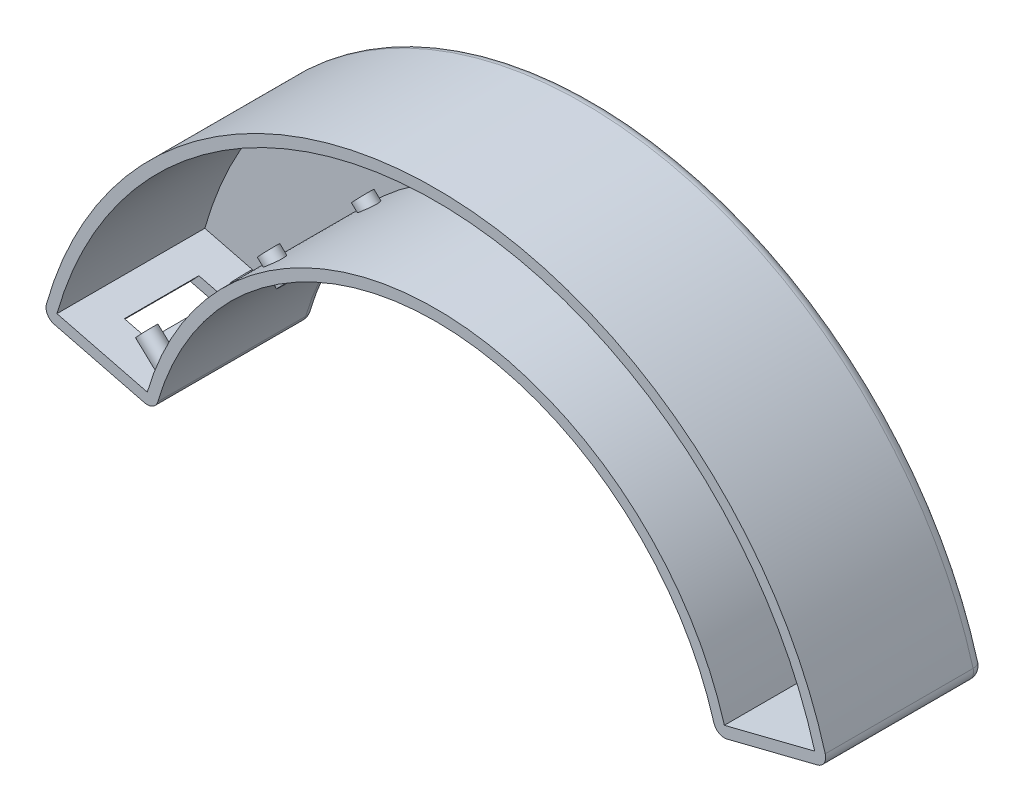
ISO-10303-21;
HEADER;
FILE_DESCRIPTION(('STEP AP214'),'2;1');
FILE_NAME('part.step','',(''),(''),'','','');
FILE_SCHEMA(('AUTOMOTIVE_DESIGN { 1 0 10303 214 1 1 1 1 }'));
ENDSEC;
DATA;
#1=APPLICATION_CONTEXT('core data for automotive mechanical design processes');
#2=APPLICATION_PROTOCOL_DEFINITION('international standard','automotive_design',2000,#1);
#3=PRODUCT_CONTEXT('',#1,'mechanical');
#4=PRODUCT('Part','Part','',(#3));
#5=PRODUCT_RELATED_PRODUCT_CATEGORY('part','',(#4));
#6=PRODUCT_DEFINITION_FORMATION('','',#4);
#7=PRODUCT_DEFINITION_CONTEXT('part definition',#1,'design');
#8=PRODUCT_DEFINITION('design','',#6,#7);
#9=PRODUCT_DEFINITION_SHAPE('','',#8);
#10=(LENGTH_UNIT() NAMED_UNIT(*) SI_UNIT(.MILLI.,.METRE.));
#11=(NAMED_UNIT(*) PLANE_ANGLE_UNIT() SI_UNIT($,.RADIAN.));
#12=(NAMED_UNIT(*) SI_UNIT($,.STERADIAN.) SOLID_ANGLE_UNIT());
#13=UNCERTAINTY_MEASURE_WITH_UNIT(LENGTH_MEASURE(1.E-05),#10,'distance_accuracy_value','');
#14=(GEOMETRIC_REPRESENTATION_CONTEXT(3) GLOBAL_UNCERTAINTY_ASSIGNED_CONTEXT((#13)) GLOBAL_UNIT_ASSIGNED_CONTEXT((#10,
#11,#12)) REPRESENTATION_CONTEXT('',''));
#15=CARTESIAN_POINT('',(0.,0.,0.));
#16=DIRECTION('',(0.,0.,1.));
#17=DIRECTION('',(1.,0.,0.));
#18=AXIS2_PLACEMENT_3D('',#15,#16,#17);
#19=CARTESIAN_POINT('',(20.0214909822142,39.2804021780634,8.6875132663522));
#20=DIRECTION('',(-0.731353701619169,0.6819983600625,0.));
#21=DIRECTION('',(-0.6819983600625,-0.731353701619169,0.));
#22=AXIS2_PLACEMENT_3D('',#19,#20,#21);
#23=PLANE('',#22);
#24=CARTESIAN_POINT('',(20.0214909822142,39.2804021780634,8.6875132663522));
#25=DIRECTION('',(-0.731353701619169,0.6819983600625,0.));
#26=DIRECTION('',(-0.6819983600625,-0.731353701619169,0.));
#27=AXIS2_PLACEMENT_3D('',#24,#25,#26);
#28=CIRCLE('',#27,2.159);
#29=CARTESIAN_POINT('',(18.5490565228393,37.7014095362676,8.6875132663522));
#30=VERTEX_POINT('',#29);
#31=EDGE_CURVE('E11',#30,#30,#28,.T.);
#32=ORIENTED_EDGE('',*,*,#31,.T.);
#33=EDGE_LOOP('',(#32));
#34=FACE_BOUND('',#33,.T.);
#35=CARTESIAN_POINT('',(20.0214909822142,39.2804021780634,8.6875132663522));
#36=DIRECTION('',(-0.731353701619169,0.6819983600625,0.));
#37=DIRECTION('',(-0.6819983600625,-0.731353701619169,0.));
#38=AXIS2_PLACEMENT_3D('',#35,#36,#37);
#39=CIRCLE('',#38,1.39700000000001);
#40=CARTESIAN_POINT('',(19.0687392732069,38.2587010569014,8.6875132663522));
#41=VERTEX_POINT('',#40);
#42=EDGE_CURVE('E55',#41,#41,#39,.T.);
#43=ORIENTED_EDGE('',*,*,#42,.F.);
#44=EDGE_LOOP('',(#43));
#45=FACE_BOUND('',#44,.T.);
#46=ADVANCED_FACE('F48',(#34,#45),#23,.T.);
#47=CARTESIAN_POINT('',(20.0214909822142,39.2804021780634,8.6875132663522));
#48=DIRECTION('',(0.731353701619169,-0.6819983600625,0.));
#49=DIRECTION('',(0.6819983600625,0.731353701619169,0.));
#50=AXIS2_PLACEMENT_3D('',#47,#48,#49);
#51=CYLINDRICAL_SURFACE('',#50,2.159);
#52=ORIENTED_EDGE('',*,*,#31,.F.);
#53=EDGE_LOOP('',(#52));
#54=FACE_BOUND('',#53,.T.);
#55=CARTESIAN_POINT('',(24.4798231472847,35.1229401751224,8.6875132663522));
#56=DIRECTION('',(-0.731353701619169,0.6819983600625,0.));
#57=DIRECTION('',(-0.6819983600625,-0.731353701619169,0.));
#58=AXIS2_PLACEMENT_3D('',#55,#56,#57);
#59=CIRCLE('',#58,2.159);
#60=CARTESIAN_POINT('',(23.0073886879097,33.5439475333266,8.6875132663522));
#61=VERTEX_POINT('',#60);
#62=EDGE_CURVE('E59',#61,#61,#59,.T.);
#63=ORIENTED_EDGE('',*,*,#62,.T.);
#64=EDGE_LOOP('',(#63));
#65=FACE_BOUND('',#64,.T.);
#66=ADVANCED_FACE('F50',(#54,#65),#51,.T.);
#67=CARTESIAN_POINT('',(20.0214909822142,39.2804021780634,8.6875132663522));
#68=DIRECTION('',(0.731353701619169,-0.6819983600625,0.));
#69=DIRECTION('',(0.6819983600625,0.731353701619169,0.));
#70=AXIS2_PLACEMENT_3D('',#67,#68,#69);
#71=CYLINDRICAL_SURFACE('',#70,1.39700000000001);
#72=ORIENTED_EDGE('',*,*,#42,.T.);
#73=EDGE_LOOP('',(#72));
#74=FACE_BOUND('',#73,.T.);
#75=CARTESIAN_POINT('',(24.4798231472847,35.1229401751224,8.6875132663522));
#76=DIRECTION('',(-0.731353701619169,0.6819983600625,0.));
#77=DIRECTION('',(-0.6819983600625,-0.731353701619169,0.));
#78=AXIS2_PLACEMENT_3D('',#75,#76,#77);
#79=CIRCLE('',#78,1.39700000000001);
#80=CARTESIAN_POINT('',(23.5270714382773,34.1012390539604,8.6875132663522));
#81=VERTEX_POINT('',#80);
#82=EDGE_CURVE('E63',#81,#81,#79,.T.);
#83=ORIENTED_EDGE('',*,*,#82,.F.);
#84=EDGE_LOOP('',(#83));
#85=FACE_BOUND('',#84,.T.);
#86=ADVANCED_FACE('F72',(#74,#85),#71,.F.);
#87=CARTESIAN_POINT('',(24.4798231472847,35.1229401751224,8.6875132663522));
#88=DIRECTION('',(-0.731353701619169,0.6819983600625,0.));
#89=DIRECTION('',(-0.6819983600625,-0.731353701619169,0.));
#90=AXIS2_PLACEMENT_3D('',#87,#88,#89);
#91=PLANE('',#90);
#92=ORIENTED_EDGE('',*,*,#82,.T.);
#93=EDGE_LOOP('',(#92));
#94=FACE_BOUND('',#93,.T.);
#95=ORIENTED_EDGE('',*,*,#62,.F.);
#96=EDGE_LOOP('',(#95));
#97=FACE_BOUND('',#96,.T.);
#98=ADVANCED_FACE('F69',(#94,#97),#91,.F.);
#99=CLOSED_SHELL('',(#46,#66,#86,#98));
#100=MANIFOLD_SOLID_BREP('B2',#99);
#101=CARTESIAN_POINT('',(20.0214909822142,39.2804021780634,30.5315132663522));
#102=DIRECTION('',(-0.731353701619169,0.6819983600625,0.));
#103=DIRECTION('',(-0.6819983600625,-0.731353701619169,0.));
#104=AXIS2_PLACEMENT_3D('',#101,#102,#103);
#105=PLANE('',#104);
#106=CARTESIAN_POINT('',(20.0214909822142,39.2804021780634,30.5315132663522));
#107=DIRECTION('',(-0.731353701619169,0.6819983600625,0.));
#108=DIRECTION('',(-0.6819983600625,-0.731353701619169,0.));
#109=AXIS2_PLACEMENT_3D('',#106,#107,#108);
#110=CIRCLE('',#109,2.159);
#111=CARTESIAN_POINT('',(18.5490565228393,37.7014095362676,30.5315132663522));
#112=VERTEX_POINT('',#111);
#113=EDGE_CURVE('E47',#112,#112,#110,.T.);
#114=ORIENTED_EDGE('',*,*,#113,.T.);
#115=EDGE_LOOP('',(#114));
#116=FACE_BOUND('',#115,.T.);
#117=CARTESIAN_POINT('',(20.0214909822142,39.2804021780634,30.5315132663522));
#118=DIRECTION('',(-0.731353701619169,0.6819983600625,0.));
#119=DIRECTION('',(-0.6819983600625,-0.731353701619169,0.));
#120=AXIS2_PLACEMENT_3D('',#117,#118,#119);
#121=CIRCLE('',#120,1.397);
#122=CARTESIAN_POINT('',(19.0687392732069,38.2587010569014,30.5315132663522));
#123=VERTEX_POINT('',#122);
#124=EDGE_CURVE('E125',#123,#123,#121,.T.);
#125=ORIENTED_EDGE('',*,*,#124,.F.);
#126=EDGE_LOOP('',(#125));
#127=FACE_BOUND('',#126,.T.);
#128=ADVANCED_FACE('F118',(#116,#127),#105,.T.);
#129=CARTESIAN_POINT('',(20.0214909822142,39.2804021780634,30.5315132663522));
#130=DIRECTION('',(0.731353701619169,-0.6819983600625,0.));
#131=DIRECTION('',(0.6819983600625,0.731353701619169,0.));
#132=AXIS2_PLACEMENT_3D('',#129,#130,#131);
#133=CYLINDRICAL_SURFACE('',#132,2.159);
#134=ORIENTED_EDGE('',*,*,#113,.F.);
#135=EDGE_LOOP('',(#134));
#136=FACE_BOUND('',#135,.T.);
#137=CARTESIAN_POINT('',(24.4798231472847,35.1229401751224,30.5315132663522));
#138=DIRECTION('',(-0.731353701619169,0.6819983600625,0.));
#139=DIRECTION('',(-0.6819983600625,-0.731353701619169,0.));
#140=AXIS2_PLACEMENT_3D('',#137,#138,#139);
#141=CIRCLE('',#140,2.159);
#142=CARTESIAN_POINT('',(23.0073886879097,33.5439475333266,30.5315132663522));
#143=VERTEX_POINT('',#142);
#144=EDGE_CURVE('E129',#143,#143,#141,.T.);
#145=ORIENTED_EDGE('',*,*,#144,.T.);
#146=EDGE_LOOP('',(#145));
#147=FACE_BOUND('',#146,.T.);
#148=ADVANCED_FACE('F120',(#136,#147),#133,.T.);
#149=CARTESIAN_POINT('',(20.0214909822142,39.2804021780634,30.5315132663522));
#150=DIRECTION('',(0.731353701619169,-0.6819983600625,0.));
#151=DIRECTION('',(0.6819983600625,0.731353701619169,0.));
#152=AXIS2_PLACEMENT_3D('',#149,#150,#151);
#153=CYLINDRICAL_SURFACE('',#152,1.397);
#154=ORIENTED_EDGE('',*,*,#124,.T.);
#155=EDGE_LOOP('',(#154));
#156=FACE_BOUND('',#155,.T.);
#157=CARTESIAN_POINT('',(24.4798231472847,35.1229401751224,30.5315132663522));
#158=DIRECTION('',(-0.731353701619169,0.6819983600625,0.));
#159=DIRECTION('',(-0.6819983600625,-0.731353701619169,0.));
#160=AXIS2_PLACEMENT_3D('',#157,#158,#159);
#161=CIRCLE('',#160,1.397);
#162=CARTESIAN_POINT('',(23.5270714382774,34.1012390539604,30.5315132663522));
#163=VERTEX_POINT('',#162);
#164=EDGE_CURVE('E133',#163,#163,#161,.T.);
#165=ORIENTED_EDGE('',*,*,#164,.F.);
#166=EDGE_LOOP('',(#165));
#167=FACE_BOUND('',#166,.T.);
#168=ADVANCED_FACE('F142',(#156,#167),#153,.F.);
#169=CARTESIAN_POINT('',(24.4798231472847,35.1229401751224,30.5315132663522));
#170=DIRECTION('',(-0.731353701619169,0.6819983600625,0.));
#171=DIRECTION('',(-0.6819983600625,-0.731353701619169,0.));
#172=AXIS2_PLACEMENT_3D('',#169,#170,#171);
#173=PLANE('',#172);
#174=ORIENTED_EDGE('',*,*,#164,.T.);
#175=EDGE_LOOP('',(#174));
#176=FACE_BOUND('',#175,.T.);
#177=ORIENTED_EDGE('',*,*,#144,.F.);
#178=EDGE_LOOP('',(#177));
#179=FACE_BOUND('',#178,.T.);
#180=ADVANCED_FACE('F139',(#176,#179),#173,.F.);
#181=CLOSED_SHELL('',(#128,#148,#168,#180));
#182=MANIFOLD_SOLID_BREP('B6',#181);
#183=CARTESIAN_POINT('',(-8.21460512109341,9.00089622362652,8.6875132663522));
#184=DIRECTION('',(-0.731353701619169,0.6819983600625,0.));
#185=DIRECTION('',(-0.6819983600625,-0.731353701619169,0.));
#186=AXIS2_PLACEMENT_3D('',#183,#184,#185);
#187=PLANE('',#186);
#188=CARTESIAN_POINT('',(-8.21460512109341,9.00089622362652,8.6875132663522));
#189=DIRECTION('',(-0.731353701619169,0.6819983600625,0.));
#190=DIRECTION('',(-0.6819983600625,-0.731353701619169,0.));
#191=AXIS2_PLACEMENT_3D('',#188,#189,#190);
#192=CIRCLE('',#191,2.159);
#193=CARTESIAN_POINT('',(-9.68703958046834,7.42190358183074,8.6875132663522));
#194=VERTEX_POINT('',#193);
#195=EDGE_CURVE('E117',#194,#194,#192,.T.);
#196=ORIENTED_EDGE('',*,*,#195,.T.);
#197=EDGE_LOOP('',(#196));
#198=FACE_BOUND('',#197,.T.);
#199=CARTESIAN_POINT('',(-8.21460512109341,9.00089622362652,8.6875132663522));
#200=DIRECTION('',(-0.731353701619169,0.6819983600625,0.));
#201=DIRECTION('',(-0.6819983600625,-0.731353701619169,0.));
#202=AXIS2_PLACEMENT_3D('',#199,#200,#201);
#203=CIRCLE('',#202,1.39699999999999);
#204=CARTESIAN_POINT('',(-9.16735683010071,7.97919510246455,8.6875132663522));
#205=VERTEX_POINT('',#204);
#206=EDGE_CURVE('E195',#205,#205,#203,.T.);
#207=ORIENTED_EDGE('',*,*,#206,.F.);
#208=EDGE_LOOP('',(#207));
#209=FACE_BOUND('',#208,.T.);
#210=ADVANCED_FACE('F188',(#198,#209),#187,.T.);
#211=CARTESIAN_POINT('',(-8.21460512109341,9.00089622362652,8.6875132663522));
#212=DIRECTION('',(0.731353701619169,-0.6819983600625,0.));
#213=DIRECTION('',(0.6819983600625,0.731353701619169,0.));
#214=AXIS2_PLACEMENT_3D('',#211,#212,#213);
#215=CYLINDRICAL_SURFACE('',#214,2.159);
#216=ORIENTED_EDGE('',*,*,#195,.F.);
#217=EDGE_LOOP('',(#216));
#218=FACE_BOUND('',#217,.T.);
#219=CARTESIAN_POINT('',(-3.75627295602295,4.84343422068553,8.6875132663522));
#220=DIRECTION('',(-0.731353701619169,0.6819983600625,0.));
#221=DIRECTION('',(-0.6819983600625,-0.731353701619169,0.));
#222=AXIS2_PLACEMENT_3D('',#219,#220,#221);
#223=CIRCLE('',#222,2.159);
#224=CARTESIAN_POINT('',(-5.22870741539788,3.26444157888974,8.6875132663522));
#225=VERTEX_POINT('',#224);
#226=EDGE_CURVE('E199',#225,#225,#223,.T.);
#227=ORIENTED_EDGE('',*,*,#226,.T.);
#228=EDGE_LOOP('',(#227));
#229=FACE_BOUND('',#228,.T.);
#230=ADVANCED_FACE('F190',(#218,#229),#215,.T.);
#231=CARTESIAN_POINT('',(-8.21460512109341,9.00089622362652,8.6875132663522));
#232=DIRECTION('',(0.731353701619169,-0.6819983600625,0.));
#233=DIRECTION('',(0.6819983600625,0.731353701619169,0.));
#234=AXIS2_PLACEMENT_3D('',#231,#232,#233);
#235=CYLINDRICAL_SURFACE('',#234,1.39699999999999);
#236=ORIENTED_EDGE('',*,*,#206,.T.);
#237=EDGE_LOOP('',(#236));
#238=FACE_BOUND('',#237,.T.);
#239=CARTESIAN_POINT('',(-3.75627295602295,4.84343422068553,8.6875132663522));
#240=DIRECTION('',(-0.731353701619169,0.6819983600625,0.));
#241=DIRECTION('',(-0.6819983600625,-0.731353701619169,0.));
#242=AXIS2_PLACEMENT_3D('',#239,#240,#241);
#243=CIRCLE('',#242,1.39699999999999);
#244=CARTESIAN_POINT('',(-4.70902466503026,3.82173309952355,8.6875132663522));
#245=VERTEX_POINT('',#244);
#246=EDGE_CURVE('E203',#245,#245,#243,.T.);
#247=ORIENTED_EDGE('',*,*,#246,.F.);
#248=EDGE_LOOP('',(#247));
#249=FACE_BOUND('',#248,.T.);
#250=ADVANCED_FACE('F212',(#238,#249),#235,.F.);
#251=CARTESIAN_POINT('',(-3.75627295602295,4.84343422068553,8.6875132663522));
#252=DIRECTION('',(-0.731353701619169,0.6819983600625,0.));
#253=DIRECTION('',(-0.6819983600625,-0.731353701619169,0.));
#254=AXIS2_PLACEMENT_3D('',#251,#252,#253);
#255=PLANE('',#254);
#256=ORIENTED_EDGE('',*,*,#246,.T.);
#257=EDGE_LOOP('',(#256));
#258=FACE_BOUND('',#257,.T.);
#259=ORIENTED_EDGE('',*,*,#226,.F.);
#260=EDGE_LOOP('',(#259));
#261=FACE_BOUND('',#260,.T.);
#262=ADVANCED_FACE('F209',(#258,#261),#255,.F.);
#263=CLOSED_SHELL('',(#210,#230,#250,#262));
#264=MANIFOLD_SOLID_BREP('B42',#263);
#265=CARTESIAN_POINT('',(-8.21460512109341,9.00089622362652,30.5315132663522));
#266=DIRECTION('',(-0.731353701619169,0.6819983600625,0.));
#267=DIRECTION('',(-0.6819983600625,-0.731353701619169,0.));
#268=AXIS2_PLACEMENT_3D('',#265,#266,#267);
#269=PLANE('',#268);
#270=CARTESIAN_POINT('',(-8.21460512109341,9.00089622362652,30.5315132663522));
#271=DIRECTION('',(-0.731353701619169,0.6819983600625,0.));
#272=DIRECTION('',(-0.6819983600625,-0.731353701619169,0.));
#273=AXIS2_PLACEMENT_3D('',#270,#271,#272);
#274=CIRCLE('',#273,2.159);
#275=CARTESIAN_POINT('',(-9.68703958046834,7.42190358183074,30.5315132663522));
#276=VERTEX_POINT('',#275);
#277=EDGE_CURVE('E187',#276,#276,#274,.T.);
#278=ORIENTED_EDGE('',*,*,#277,.T.);
#279=EDGE_LOOP('',(#278));
#280=FACE_BOUND('',#279,.T.);
#281=CARTESIAN_POINT('',(-8.21460512109341,9.00089622362652,30.5315132663522));
#282=DIRECTION('',(-0.731353701619169,0.6819983600625,0.));
#283=DIRECTION('',(-0.6819983600625,-0.731353701619169,0.));
#284=AXIS2_PLACEMENT_3D('',#281,#282,#283);
#285=CIRCLE('',#284,1.39699999999999);
#286=CARTESIAN_POINT('',(-9.16735683010071,7.97919510246455,30.5315132663522));
#287=VERTEX_POINT('',#286);
#288=EDGE_CURVE('E266',#287,#287,#285,.T.);
#289=ORIENTED_EDGE('',*,*,#288,.F.);
#290=EDGE_LOOP('',(#289));
#291=FACE_BOUND('',#290,.T.);
#292=ADVANCED_FACE('F259',(#280,#291),#269,.T.);
#293=CARTESIAN_POINT('',(-8.21460512109341,9.00089622362652,30.5315132663522));
#294=DIRECTION('',(0.731353701619169,-0.6819983600625,0.));
#295=DIRECTION('',(0.6819983600625,0.731353701619169,0.));
#296=AXIS2_PLACEMENT_3D('',#293,#294,#295);
#297=CYLINDRICAL_SURFACE('',#296,2.159);
#298=ORIENTED_EDGE('',*,*,#277,.F.);
#299=EDGE_LOOP('',(#298));
#300=FACE_BOUND('',#299,.T.);
#301=CARTESIAN_POINT('',(-3.75627295602295,4.84343422068553,30.5315132663522));
#302=DIRECTION('',(-0.731353701619169,0.6819983600625,0.));
#303=DIRECTION('',(-0.6819983600625,-0.731353701619169,0.));
#304=AXIS2_PLACEMENT_3D('',#301,#302,#303);
#305=CIRCLE('',#304,2.159);
#306=CARTESIAN_POINT('',(-5.22870741539789,3.26444157888974,30.5315132663522));
#307=VERTEX_POINT('',#306);
#308=EDGE_CURVE('E270',#307,#307,#305,.T.);
#309=ORIENTED_EDGE('',*,*,#308,.T.);
#310=EDGE_LOOP('',(#309));
#311=FACE_BOUND('',#310,.T.);
#312=ADVANCED_FACE('F261',(#300,#311),#297,.T.);
#313=CARTESIAN_POINT('',(-8.21460512109341,9.00089622362652,30.5315132663522));
#314=DIRECTION('',(0.731353701619169,-0.6819983600625,0.));
#315=DIRECTION('',(0.6819983600625,0.731353701619169,0.));
#316=AXIS2_PLACEMENT_3D('',#313,#314,#315);
#317=CYLINDRICAL_SURFACE('',#316,1.39699999999999);
#318=ORIENTED_EDGE('',*,*,#288,.T.);
#319=EDGE_LOOP('',(#318));
#320=FACE_BOUND('',#319,.T.);
#321=CARTESIAN_POINT('',(-3.75627295602295,4.84343422068553,30.5315132663522));
#322=DIRECTION('',(-0.731353701619169,0.6819983600625,0.));
#323=DIRECTION('',(-0.6819983600625,-0.731353701619169,0.));
#324=AXIS2_PLACEMENT_3D('',#321,#322,#323);
#325=CIRCLE('',#324,1.39699999999999);
#326=CARTESIAN_POINT('',(-4.70902466503026,3.82173309952355,30.5315132663522));
#327=VERTEX_POINT('',#326);
#328=EDGE_CURVE('E274',#327,#327,#325,.T.);
#329=ORIENTED_EDGE('',*,*,#328,.F.);
#330=EDGE_LOOP('',(#329));
#331=FACE_BOUND('',#330,.T.);
#332=ADVANCED_FACE('F283',(#320,#331),#317,.F.);
#333=CARTESIAN_POINT('',(-3.75627295602295,4.84343422068553,30.5315132663522));
#334=DIRECTION('',(-0.731353701619169,0.6819983600625,0.));
#335=DIRECTION('',(-0.6819983600625,-0.731353701619169,0.));
#336=AXIS2_PLACEMENT_3D('',#333,#334,#335);
#337=PLANE('',#336);
#338=ORIENTED_EDGE('',*,*,#328,.T.);
#339=EDGE_LOOP('',(#338));
#340=FACE_BOUND('',#339,.T.);
#341=ORIENTED_EDGE('',*,*,#308,.F.);
#342=EDGE_LOOP('',(#341));
#343=FACE_BOUND('',#342,.T.);
#344=ADVANCED_FACE('F280',(#340,#343),#337,.F.);
#345=CLOSED_SHELL('',(#292,#312,#332,#344));
#346=MANIFOLD_SOLID_BREP('B112',#345);
#347=CARTESIAN_POINT('',(0.620773039929204,2.46297398136827,36.83));
#348=DIRECTION('',(-0.244398834617797,-0.969674795814278,0.));
#349=DIRECTION('',(0.969674795814279,-0.244398834617797,0.));
#350=AXIS2_PLACEMENT_3D('',#347,#348,#349);
#351=PLANE('',#350);
#352=DIRECTION('',(-0.969674795814279,0.244398834617797,0.));
#353=VECTOR('',#352,1.);
#354=CARTESIAN_POINT('',(-1.79730203338088,3.07243060794693,2.54));
#355=LINE('',#354,#353);
#356=CARTESIAN_POINT('',(-1.79730203338088,3.07243060794693,2.54));
#357=VERTEX_POINT('',#356);
#358=CARTESIAN_POINT('',(-22.7432053101075,8.35167925187018,2.54));
#359=VERTEX_POINT('',#358);
#360=EDGE_CURVE('E468',#357,#359,#355,.T.);
#361=ORIENTED_EDGE('',*,*,#360,.T.);
#362=DIRECTION('',(0.,0.,-1.));
#363=VECTOR('',#362,1.);
#364=CARTESIAN_POINT('',(-22.7432053101074,8.35167925187017,36.83));
#365=LINE('',#364,#363);
#366=CARTESIAN_POINT('',(-22.7432053101074,8.35167925187017,36.83));
#367=VERTEX_POINT('',#366);
#368=EDGE_CURVE('E511',#367,#359,#365,.T.);
#369=ORIENTED_EDGE('',*,*,#368,.F.);
#370=DIRECTION('',(-0.969674795814279,0.244398834617797,0.));
#371=VECTOR('',#370,1.);
#372=CARTESIAN_POINT('',(0.620773039929204,2.46297398136827,36.83));
#373=LINE('',#372,#371);
#374=CARTESIAN_POINT('',(-1.79730203338088,3.07243060794693,36.83));
#375=VERTEX_POINT('',#374);
#376=EDGE_CURVE('E491',#375,#367,#373,.T.);
#377=ORIENTED_EDGE('',*,*,#376,.F.);
#378=DIRECTION('',(0.,0.,-1.));
#379=VECTOR('',#378,1.);
#380=CARTESIAN_POINT('',(-1.79730203338088,3.07243060794693,36.83));
#381=LINE('',#380,#379);
#382=EDGE_CURVE('E502',#375,#357,#381,.T.);
#383=ORIENTED_EDGE('',*,*,#382,.T.);
#384=EDGE_LOOP('',(#361,#369,#377,#383));
#385=FACE_BOUND('',#384,.T.);
#386=DIRECTION('',(0.969674795814279,-0.244398834617797,0.));
#387=VECTOR('',#386,1.);
#388=CARTESIAN_POINT('',(0.620773039929204,2.46297398136827,28.2455132663522));
#389=LINE('',#388,#387);
#390=CARTESIAN_POINT('',(-15.6877843075608,6.57341639693815,28.2455132663522));
#391=VERTEX_POINT('',#390);
#392=CARTESIAN_POINT('',(-10.063624173378,5.15589148195476,28.2455132663522));
#393=VERTEX_POINT('',#392);
#394=EDGE_CURVE('E454',#391,#393,#389,.T.);
#395=ORIENTED_EDGE('',*,*,#394,.F.);
#396=DIRECTION('',(0.,0.,1.));
#397=VECTOR('',#396,1.);
#398=CARTESIAN_POINT('',(-15.6877843075608,6.57341639693815,36.83));
#399=LINE('',#398,#397);
#400=CARTESIAN_POINT('',(-15.6877843075608,6.57341639693815,10.9735132663522));
#401=VERTEX_POINT('',#400);
#402=EDGE_CURVE('E443',#401,#391,#399,.T.);
#403=ORIENTED_EDGE('',*,*,#402,.F.);
#404=DIRECTION('',(-0.969674795814279,0.244398834617797,0.));
#405=VECTOR('',#404,1.);
#406=CARTESIAN_POINT('',(0.620773039929204,2.46297398136827,10.9735132663522));
#407=LINE('',#406,#405);
#408=CARTESIAN_POINT('',(-10.063624173378,5.15589148195476,10.9735132663522));
#409=VERTEX_POINT('',#408);
#410=EDGE_CURVE('E448',#409,#401,#407,.T.);
#411=ORIENTED_EDGE('',*,*,#410,.F.);
#412=DIRECTION('',(0.,0.,-1.));
#413=VECTOR('',#412,1.);
#414=CARTESIAN_POINT('',(-10.063624173378,5.15589148195476,36.83));
#415=LINE('',#414,#413);
#416=EDGE_CURVE('E459',#393,#409,#415,.T.);
#417=ORIENTED_EDGE('',*,*,#416,.F.);
#418=EDGE_LOOP('',(#395,#403,#411,#417));
#419=FACE_BOUND('',#418,.T.);
#420=ADVANCED_FACE('F321',(#385,#419),#351,.F.);
#421=CARTESIAN_POINT('',(0.,0.,36.83));
#422=DIRECTION('',(-0.2443988346178,-0.969674795814278,0.));
#423=DIRECTION('',(0.969674795814278,-0.2443988346178,0.));
#424=AXIS2_PLACEMENT_3D('',#421,#422,#423);
#425=PLANE('',#424);
#426=DIRECTION('',(-0.969674795814278,0.2443988346178,0.));
#427=VECTOR('',#426,1.);
#428=CARTESIAN_POINT('',(0.,0.,2.54));
#429=LINE('',#428,#427);
#430=CARTESIAN_POINT('',(-23.3639783500367,5.88870527050194,2.54));
#431=VERTEX_POINT('',#430);
#432=CARTESIAN_POINT('',(-2.41807507331012,0.609456626578631,2.54));
#433=VERTEX_POINT('',#432);
#434=EDGE_CURVE('E526',#431,#433,#429,.F.);
#435=ORIENTED_EDGE('',*,*,#434,.T.);
#436=DIRECTION('',(0.,0.,1.));
#437=VECTOR('',#436,1.);
#438=CARTESIAN_POINT('',(-2.41807507331012,0.609456626578631,36.83));
#439=LINE('',#438,#437);
#440=CARTESIAN_POINT('',(-2.41807507331012,0.609456626578632,36.83));
#441=VERTEX_POINT('',#440);
#442=EDGE_CURVE('E580',#433,#441,#439,.T.);
#443=ORIENTED_EDGE('',*,*,#442,.T.);
#444=DIRECTION('',(-0.969674795814278,0.2443988346178,0.));
#445=VECTOR('',#444,1.);
#446=CARTESIAN_POINT('',(0.,0.,36.83));
#447=LINE('',#446,#445);
#448=CARTESIAN_POINT('',(-23.3639783500367,5.88870527050194,36.83));
#449=VERTEX_POINT('',#448);
#450=EDGE_CURVE('E482',#441,#449,#447,.T.);
#451=ORIENTED_EDGE('',*,*,#450,.T.);
#452=DIRECTION('',(0.,0.,-1.));
#453=VECTOR('',#452,1.);
#454=CARTESIAN_POINT('',(-23.3639783500367,5.88870527050194,36.83));
#455=LINE('',#454,#453);
#456=EDGE_CURVE('E578',#449,#431,#455,.T.);
#457=ORIENTED_EDGE('',*,*,#456,.T.);
#458=EDGE_LOOP('',(#435,#443,#451,#457));
#459=FACE_BOUND('',#458,.T.);
#460=DIRECTION('',(0.,0.,1.));
#461=VECTOR('',#460,1.);
#462=CARTESIAN_POINT('',(-17.6655958402513,4.45247319495489,36.83));
#463=LINE('',#462,#461);
#464=CARTESIAN_POINT('',(-17.6655958402513,4.45247319495489,10.9735132663522));
#465=VERTEX_POINT('',#464);
#466=CARTESIAN_POINT('',(-17.6655958402513,4.45247319495489,28.2455132663522));
#467=VERTEX_POINT('',#466);
#468=EDGE_CURVE('E582',#465,#467,#463,.T.);
#469=ORIENTED_EDGE('',*,*,#468,.T.);
#470=DIRECTION('',(0.969674795814278,-0.2443988346178,0.));
#471=VECTOR('',#470,1.);
#472=CARTESIAN_POINT('',(0.,0.,28.2455132663522));
#473=LINE('',#472,#471);
#474=CARTESIAN_POINT('',(-12.0414357060685,3.03494827997149,28.2455132663522));
#475=VERTEX_POINT('',#474);
#476=EDGE_CURVE('E257',#467,#475,#473,.T.);
#477=ORIENTED_EDGE('',*,*,#476,.T.);
#478=DIRECTION('',(0.,0.,-1.));
#479=VECTOR('',#478,1.);
#480=CARTESIAN_POINT('',(-12.0414357060685,3.03494827997149,36.83));
#481=LINE('',#480,#479);
#482=CARTESIAN_POINT('',(-12.0414357060685,3.03494827997149,10.9735132663522));
#483=VERTEX_POINT('',#482);
#484=EDGE_CURVE('E329',#475,#483,#481,.T.);
#485=ORIENTED_EDGE('',*,*,#484,.T.);
#486=DIRECTION('',(-0.969674795814278,0.2443988346178,0.));
#487=VECTOR('',#486,1.);
#488=CARTESIAN_POINT('',(0.,0.,10.9735132663522));
#489=LINE('',#488,#487);
#490=EDGE_CURVE('E589',#483,#465,#489,.T.);
#491=ORIENTED_EDGE('',*,*,#490,.T.);
#492=EDGE_LOOP('',(#469,#477,#485,#491));
#493=FACE_BOUND('',#492,.T.);
#494=ADVANCED_FACE('F593',(#459,#493),#425,.T.);
#495=CARTESIAN_POINT('',(65.1139115965482,-16.411444517581,36.83));
#496=DIRECTION('',(0.,0.,-1.));
#497=DIRECTION('',(-1.,0.,0.));
#498=AXIS2_PLACEMENT_3D('',#495,#496,#497);
#499=CYLINDRICAL_SURFACE('',#498,91.2802568465433);
#500=CARTESIAN_POINT('',(65.1139115965482,-16.411444517581,2.54));
#501=DIRECTION('',(0.,0.,-1.));
#502=DIRECTION('',(-1.,0.,0.));
#503=AXIS2_PLACEMENT_3D('',#500,#501,#502);
#504=CIRCLE('',#503,91.2802568465433);
#505=CARTESIAN_POINT('',(152.971028503204,8.35167925187018,2.54));
#506=VERTEX_POINT('',#505);
#507=EDGE_CURVE('E471',#359,#506,#504,.T.);
#508=ORIENTED_EDGE('',*,*,#507,.T.);
#509=DIRECTION('',(0.,0.,-1.));
#510=VECTOR('',#509,1.);
#511=CARTESIAN_POINT('',(152.971028503204,8.35167925187017,36.83));
#512=LINE('',#511,#510);
#513=CARTESIAN_POINT('',(152.971028503204,8.35167925187017,36.83));
#514=VERTEX_POINT('',#513);
#515=EDGE_CURVE('E508',#514,#506,#512,.T.);
#516=ORIENTED_EDGE('',*,*,#515,.F.);
#517=CARTESIAN_POINT('',(65.1139115965482,-16.411444517581,36.83));
#518=DIRECTION('',(0.,0.,1.));
#519=DIRECTION('',(1.,0.,0.));
#520=AXIS2_PLACEMENT_3D('',#517,#518,#519);
#521=CIRCLE('',#520,91.2802568465433);
#522=EDGE_CURVE('E494',#367,#514,#521,.F.);
#523=ORIENTED_EDGE('',*,*,#522,.F.);
#524=ORIENTED_EDGE('',*,*,#368,.T.);
#525=EDGE_LOOP('',(#508,#516,#523,#524));
#526=FACE_BOUND('',#525,.T.);
#527=ADVANCED_FACE('F618',(#526),#499,.F.);
#528=CARTESIAN_POINT('',(7.15783776658722,-28.3993779497415,36.83));
#529=DIRECTION('',(-0.244398834617797,0.969674795814278,0.));
#530=DIRECTION('',(-0.969674795814279,-0.244398834617797,0.));
#531=AXIS2_PLACEMENT_3D('',#528,#529,#530);
#532=PLANE('',#531);
#533=ORIENTED_EDGE('',*,*,#515,.T.);
#534=DIRECTION('',(0.969674795814278,0.244398834617797,0.));
#535=VECTOR('',#534,1.);
#536=CARTESIAN_POINT('',(132.025125226477,3.07243060794694,2.54));
#537=LINE('',#536,#535);
#538=CARTESIAN_POINT('',(132.025125226477,3.07243060794693,2.54));
#539=VERTEX_POINT('',#538);
#540=EDGE_CURVE('E475',#539,#506,#537,.T.);
#541=ORIENTED_EDGE('',*,*,#540,.F.);
#542=DIRECTION('',(0.,0.,-1.));
#543=VECTOR('',#542,1.);
#544=CARTESIAN_POINT('',(132.025125226477,3.07243060794694,36.83));
#545=LINE('',#544,#543);
#546=CARTESIAN_POINT('',(132.025125226477,3.07243060794694,36.83));
#547=VERTEX_POINT('',#546);
#548=EDGE_CURVE('E505',#547,#539,#545,.T.);
#549=ORIENTED_EDGE('',*,*,#548,.F.);
#550=DIRECTION('',(0.969674795814279,0.244398834617797,0.));
#551=VECTOR('',#550,1.);
#552=CARTESIAN_POINT('',(7.15783776658722,-28.3993779497415,36.83));
#553=LINE('',#552,#551);
#554=EDGE_CURVE('E496',#547,#514,#553,.T.);
#555=ORIENTED_EDGE('',*,*,#554,.T.);
#556=EDGE_LOOP('',(#533,#541,#549,#555));
#557=FACE_BOUND('',#556,.T.);
#558=ADVANCED_FACE('F736',(#557),#532,.T.);
#559=CARTESIAN_POINT('',(65.1139115965482,-16.411444517581,36.83));
#560=DIRECTION('',(0.,0.,-1.));
#561=DIRECTION('',(-1.,0.,0.));
#562=AXIS2_PLACEMENT_3D('',#559,#560,#561);
#563=CYLINDRICAL_SURFACE('',#562,69.6902568465433);
#564=ORIENTED_EDGE('',*,*,#548,.T.);
#565=CARTESIAN_POINT('',(65.1139115965482,-16.411444517581,2.54));
#566=DIRECTION('',(0.,0.,-1.));
#567=DIRECTION('',(-1.,0.,0.));
#568=AXIS2_PLACEMENT_3D('',#565,#566,#567);
#569=CIRCLE('',#568,69.6902568465433);
#570=EDGE_CURVE('E477',#357,#539,#569,.T.);
#571=ORIENTED_EDGE('',*,*,#570,.F.);
#572=ORIENTED_EDGE('',*,*,#382,.F.);
#573=CARTESIAN_POINT('',(65.1139115965482,-16.411444517581,36.83));
#574=DIRECTION('',(0.,0.,1.));
#575=DIRECTION('',(1.,0.,0.));
#576=AXIS2_PLACEMENT_3D('',#573,#574,#575);
#577=CIRCLE('',#576,69.6902568465433);
#578=EDGE_CURVE('E499',#375,#547,#577,.F.);
#579=ORIENTED_EDGE('',*,*,#578,.T.);
#580=EDGE_LOOP('',(#564,#571,#572,#579));
#581=FACE_BOUND('',#580,.T.);
#582=ADVANCED_FACE('F636',(#581),#563,.T.);
#583=CARTESIAN_POINT('',(65.1139115965482,-16.411444517581,36.83));
#584=DIRECTION('',(0.,0.,-1.));
#585=DIRECTION('',(-1.,0.,0.));
#586=AXIS2_PLACEMENT_3D('',#583,#584,#585);
#587=CYLINDRICAL_SURFACE('',#586,93.8202568465433);
#588=CARTESIAN_POINT('',(65.1139115965482,-16.411444517581,36.83));
#589=DIRECTION('',(0.,0.,1.));
#590=DIRECTION('',(1.,0.,0.));
#591=AXIS2_PLACEMENT_3D('',#588,#589,#590);
#592=CIRCLE('',#591,93.8202568465433);
#593=CARTESIAN_POINT('',(-25.1879516841023,9.0407475843591,36.83));
#594=VERTEX_POINT('',#593);
#595=CARTESIAN_POINT('',(155.415774877199,9.04074758435906,36.83));
#596=VERTEX_POINT('',#595);
#597=EDGE_CURVE('E479',#594,#596,#592,.F.);
#598=ORIENTED_EDGE('',*,*,#597,.T.);
#599=DIRECTION('',(0.,0.,-1.));
#600=VECTOR('',#599,1.);
#601=CARTESIAN_POINT('',(155.415774877199,9.04074758435906,36.83));
#602=LINE('',#601,#600);
#603=CARTESIAN_POINT('',(155.415774877199,9.04074758435906,2.54));
#604=VERTEX_POINT('',#603);
#605=EDGE_CURVE('E560',#596,#604,#602,.T.);
#606=ORIENTED_EDGE('',*,*,#605,.T.);
#607=CARTESIAN_POINT('',(65.1139115965482,-16.411444517581,2.54));
#608=DIRECTION('',(0.,0.,1.));
#609=DIRECTION('',(1.,0.,0.));
#610=AXIS2_PLACEMENT_3D('',#607,#608,#609);
#611=CIRCLE('',#610,93.8202568465433);
#612=CARTESIAN_POINT('',(-25.1879516841023,9.0407475843591,2.54));
#613=VERTEX_POINT('',#612);
#614=EDGE_CURVE('E535',#604,#613,#611,.T.);
#615=ORIENTED_EDGE('',*,*,#614,.T.);
#616=DIRECTION('',(0.,0.,-1.));
#617=VECTOR('',#616,1.);
#618=CARTESIAN_POINT('',(-25.1879516841023,9.0407475843591,36.83));
#619=LINE('',#618,#617);
#620=EDGE_CURVE('E558',#613,#594,#619,.F.);
#621=ORIENTED_EDGE('',*,*,#620,.T.);
#622=EDGE_LOOP('',(#598,#606,#615,#621));
#623=FACE_BOUND('',#622,.T.);
#624=ADVANCED_FACE('F631',(#623),#587,.T.);
#625=CARTESIAN_POINT('',(65.1139115965482,-16.411444517581,36.83));
#626=DIRECTION('',(0.,0.,-1.));
#627=DIRECTION('',(-1.,0.,0.));
#628=AXIS2_PLACEMENT_3D('',#625,#626,#627);
#629=CYLINDRICAL_SURFACE('',#628,67.1502568465433);
#630=CARTESIAN_POINT('',(65.1139115965482,-16.411444517581,2.54));
#631=DIRECTION('',(0.,0.,1.));
#632=DIRECTION('',(1.,0.,0.));
#633=AXIS2_PLACEMENT_3D('',#630,#631,#632);
#634=CIRCLE('',#633,67.1502568465433);
#635=CARTESIAN_POINT('',(0.641410210057328,2.36230203247307,2.54));
#636=VERTEX_POINT('',#635);
#637=CARTESIAN_POINT('',(129.586412983039,2.36230203247311,2.54));
#638=VERTEX_POINT('',#637);
#639=EDGE_CURVE('E529',#636,#638,#634,.F.);
#640=ORIENTED_EDGE('',*,*,#639,.T.);
#641=DIRECTION('',(0.,0.,-1.));
#642=VECTOR('',#641,1.);
#643=CARTESIAN_POINT('',(129.586412983039,2.36230203247311,36.83));
#644=LINE('',#643,#642);
#645=CARTESIAN_POINT('',(129.586412983039,2.36230203247311,36.83));
#646=VERTEX_POINT('',#645);
#647=EDGE_CURVE('E576',#638,#646,#644,.F.);
#648=ORIENTED_EDGE('',*,*,#647,.T.);
#649=CARTESIAN_POINT('',(65.1139115965482,-16.411444517581,36.83));
#650=DIRECTION('',(0.,0.,1.));
#651=DIRECTION('',(1.,0.,0.));
#652=AXIS2_PLACEMENT_3D('',#649,#650,#651);
#653=CIRCLE('',#652,67.1502568465433);
#654=CARTESIAN_POINT('',(0.641410210057328,2.36230203247307,36.83));
#655=VERTEX_POINT('',#654);
#656=EDGE_CURVE('E485',#655,#646,#653,.F.);
#657=ORIENTED_EDGE('',*,*,#656,.F.);
#658=DIRECTION('',(0.,0.,-1.));
#659=VECTOR('',#658,1.);
#660=CARTESIAN_POINT('',(0.641410210057314,2.36230203247308,36.83));
#661=LINE('',#660,#659);
#662=EDGE_CURVE('E574',#655,#636,#661,.T.);
#663=ORIENTED_EDGE('',*,*,#662,.T.);
#664=EDGE_LOOP('',(#640,#648,#657,#663));
#665=FACE_BOUND('',#664,.T.);
#666=ADVANCED_FACE('F628',(#665),#629,.F.);
#667=CARTESIAN_POINT('',(7.77861080651641,-30.8623519311098,36.83));
#668=DIRECTION('',(-0.244398834617797,0.969674795814279,0.));
#669=DIRECTION('',(-0.969674795814279,-0.244398834617797,0.));
#670=AXIS2_PLACEMENT_3D('',#667,#668,#669);
#671=PLANE('',#670);
#672=DIRECTION('',(0.969674795814279,0.244398834617797,0.));
#673=VECTOR('',#672,1.);
#674=CARTESIAN_POINT('',(7.77861080651641,-30.8623519311098,2.54));
#675=LINE('',#674,#673);
#676=CARTESIAN_POINT('',(132.645898266407,0.609456626578662,2.54));
#677=VERTEX_POINT('',#676);
#678=CARTESIAN_POINT('',(153.591801543133,5.88870527050189,2.54));
#679=VERTEX_POINT('',#678);
#680=EDGE_CURVE('E532',#677,#679,#675,.T.);
#681=ORIENTED_EDGE('',*,*,#680,.T.);
#682=DIRECTION('',(0.,0.,1.));
#683=VECTOR('',#682,1.);
#684=CARTESIAN_POINT('',(153.591801543133,5.88870527050189,36.83));
#685=LINE('',#684,#683);
#686=CARTESIAN_POINT('',(153.591801543133,5.8887052705019,36.83));
#687=VERTEX_POINT('',#686);
#688=EDGE_CURVE('E564',#679,#687,#685,.T.);
#689=ORIENTED_EDGE('',*,*,#688,.T.);
#690=DIRECTION('',(0.969674795814279,0.244398834617797,0.));
#691=VECTOR('',#690,1.);
#692=CARTESIAN_POINT('',(7.77861080651641,-30.8623519311098,36.83));
#693=LINE('',#692,#691);
#694=CARTESIAN_POINT('',(132.645898266407,0.609456626578669,36.83));
#695=VERTEX_POINT('',#694);
#696=EDGE_CURVE('E488',#695,#687,#693,.T.);
#697=ORIENTED_EDGE('',*,*,#696,.F.);
#698=DIRECTION('',(0.,0.,-1.));
#699=VECTOR('',#698,1.);
#700=CARTESIAN_POINT('',(132.645898266407,0.609456626578662,36.83));
#701=LINE('',#700,#699);
#702=EDGE_CURVE('E562',#695,#677,#701,.T.);
#703=ORIENTED_EDGE('',*,*,#702,.T.);
#704=EDGE_LOOP('',(#681,#689,#697,#703));
#705=FACE_BOUND('',#704,.T.);
#706=ADVANCED_FACE('F624',(#705),#671,.F.);
#707=CARTESIAN_POINT('',(0.,0.,36.83));
#708=DIRECTION('',(0.,0.,1.));
#709=DIRECTION('',(1.,0.,0.));
#710=AXIS2_PLACEMENT_3D('',#707,#708,#709);
#711=PLANE('',#710);
#712=ORIENTED_EDGE('',*,*,#696,.T.);
#713=CARTESIAN_POINT('',(152.971028503204,8.35167925187016,36.83));
#714=DIRECTION('',(0.,0.,1.));
#715=DIRECTION('',(1.,0.,0.));
#716=AXIS2_PLACEMENT_3D('',#713,#714,#715);
#717=CIRCLE('',#716,2.54);
#718=EDGE_CURVE('E572',#687,#596,#717,.T.);
#719=ORIENTED_EDGE('',*,*,#718,.T.);
#720=ORIENTED_EDGE('',*,*,#597,.F.);
#721=CARTESIAN_POINT('',(-22.7432053101075,8.3516792518702,36.83));
#722=DIRECTION('',(0.,0.,1.));
#723=DIRECTION('',(1.,0.,0.));
#724=AXIS2_PLACEMENT_3D('',#721,#722,#723);
#725=CIRCLE('',#724,2.54);
#726=EDGE_CURVE('E566',#594,#449,#725,.T.);
#727=ORIENTED_EDGE('',*,*,#726,.T.);
#728=ORIENTED_EDGE('',*,*,#450,.F.);
#729=CARTESIAN_POINT('',(-1.79730203338091,3.0724306079469,36.83));
#730=DIRECTION('',(0.,0.,1.));
#731=DIRECTION('',(1.,0.,0.));
#732=AXIS2_PLACEMENT_3D('',#729,#730,#731);
#733=CIRCLE('',#732,2.54);
#734=EDGE_CURVE('E568',#441,#655,#733,.T.);
#735=ORIENTED_EDGE('',*,*,#734,.T.);
#736=ORIENTED_EDGE('',*,*,#656,.T.);
#737=CARTESIAN_POINT('',(132.025125226477,3.07243060794693,36.83));
#738=DIRECTION('',(0.,0.,1.));
#739=DIRECTION('',(1.,0.,0.));
#740=AXIS2_PLACEMENT_3D('',#737,#738,#739);
#741=CIRCLE('',#740,2.54);
#742=EDGE_CURVE('E570',#646,#695,#741,.T.);
#743=ORIENTED_EDGE('',*,*,#742,.T.);
#744=EDGE_LOOP('',(#712,#719,#720,#727,#728,#735,#736,#743));
#745=FACE_BOUND('',#744,.T.);
#746=ORIENTED_EDGE('',*,*,#376,.T.);
#747=ORIENTED_EDGE('',*,*,#522,.T.);
#748=ORIENTED_EDGE('',*,*,#554,.F.);
#749=ORIENTED_EDGE('',*,*,#578,.F.);
#750=EDGE_LOOP('',(#746,#747,#748,#749));
#751=FACE_BOUND('',#750,.T.);
#752=ADVANCED_FACE('F627',(#745,#751),#711,.T.);
#753=CARTESIAN_POINT('',(0.,0.,0.));
#754=DIRECTION('',(0.,0.,1.));
#755=DIRECTION('',(1.,0.,0.));
#756=AXIS2_PLACEMENT_3D('',#753,#754,#755);
#757=PLANE('',#756);
#758=CARTESIAN_POINT('',(65.1139115965482,-16.411444517581,0.));
#759=DIRECTION('',(0.,0.,1.));
#760=DIRECTION('',(1.,0.,0.));
#761=AXIS2_PLACEMENT_3D('',#758,#759,#760);
#762=CIRCLE('',#761,69.6902568465433);
#763=CARTESIAN_POINT('',(132.025125226477,3.07243060794694,0.));
#764=VERTEX_POINT('',#763);
#765=CARTESIAN_POINT('',(-1.7973020333809,3.0724306079469,0.));
#766=VERTEX_POINT('',#765);
#767=EDGE_CURVE('E520',#764,#766,#762,.T.);
#768=ORIENTED_EDGE('',*,*,#767,.T.);
#769=DIRECTION('',(-0.969674795814278,0.2443988346178,0.));
#770=VECTOR('',#769,1.);
#771=CARTESIAN_POINT('',(-25.2404537644376,8.98109090062495,0.));
#772=LINE('',#771,#770);
#773=CARTESIAN_POINT('',(-22.7432053101074,8.3516792518702,0.));
#774=VERTEX_POINT('',#773);
#775=EDGE_CURVE('E523',#766,#774,#772,.T.);
#776=ORIENTED_EDGE('',*,*,#775,.T.);
#777=CARTESIAN_POINT('',(65.1139115965482,-16.411444517581,0.));
#778=DIRECTION('',(0.,0.,1.));
#779=DIRECTION('',(1.,0.,0.));
#780=AXIS2_PLACEMENT_3D('',#777,#778,#779);
#781=CIRCLE('',#780,91.2802568465433);
#782=CARTESIAN_POINT('',(152.971028503204,8.35167925187016,0.));
#783=VERTEX_POINT('',#782);
#784=EDGE_CURVE('E514',#774,#783,#781,.F.);
#785=ORIENTED_EDGE('',*,*,#784,.T.);
#786=DIRECTION('',(0.969674795814279,0.244398834617797,0.));
#787=VECTOR('',#786,1.);
#788=CARTESIAN_POINT('',(7.15783776658721,-28.3993779497415,0.));
#789=LINE('',#788,#787);
#790=EDGE_CURVE('E517',#783,#764,#789,.F.);
#791=ORIENTED_EDGE('',*,*,#790,.T.);
#792=EDGE_LOOP('',(#768,#776,#785,#791));
#793=FACE_BOUND('',#792,.T.);
#794=ADVANCED_FACE('F707',(#793),#757,.F.);
#795=CARTESIAN_POINT('',(65.1139115965482,-16.411444517581,2.54));
#796=DIRECTION('',(0.,0.,-1.));
#797=DIRECTION('',(-1.,0.,0.));
#798=AXIS2_PLACEMENT_3D('',#795,#796,#797);
#799=PLANE('',#798);
#800=ORIENTED_EDGE('',*,*,#360,.F.);
#801=ORIENTED_EDGE('',*,*,#570,.T.);
#802=ORIENTED_EDGE('',*,*,#540,.T.);
#803=ORIENTED_EDGE('',*,*,#507,.F.);
#804=EDGE_LOOP('',(#800,#801,#802,#803));
#805=FACE_BOUND('',#804,.T.);
#806=ADVANCED_FACE('F654',(#805),#799,.F.);
#807=CARTESIAN_POINT('',(7.15783776658721,-28.3993779497415,2.54));
#808=DIRECTION('',(0.969674795814279,0.244398834617797,0.));
#809=DIRECTION('',(-0.244398834617797,0.969674795814279,0.));
#810=AXIS2_PLACEMENT_3D('',#807,#808,#809);
#811=CYLINDRICAL_SURFACE('',#810,2.54);
#812=ORIENTED_EDGE('',*,*,#790,.F.);
#813=CARTESIAN_POINT('',(152.971028503204,8.35167925187016,2.54));
#814=DIRECTION('',(0.969674795814279,0.244398834617797,0.));
#815=DIRECTION('',(-0.244398834617797,0.969674795814279,0.));
#816=AXIS2_PLACEMENT_3D('',#813,#814,#815);
#817=CIRCLE('',#816,2.54);
#818=EDGE_CURVE('E545',#783,#679,#817,.F.);
#819=ORIENTED_EDGE('',*,*,#818,.T.);
#820=ORIENTED_EDGE('',*,*,#680,.F.);
#821=CARTESIAN_POINT('',(132.025125226477,3.07243060794693,2.54));
#822=DIRECTION('',(0.969674795814279,0.244398834617797,0.));
#823=DIRECTION('',(-0.244398834617797,0.969674795814279,0.));
#824=AXIS2_PLACEMENT_3D('',#821,#822,#823);
#825=CIRCLE('',#824,2.54);
#826=EDGE_CURVE('E543',#677,#764,#825,.T.);
#827=ORIENTED_EDGE('',*,*,#826,.T.);
#828=EDGE_LOOP('',(#812,#819,#820,#827));
#829=FACE_BOUND('',#828,.T.);
#830=ADVANCED_FACE('F650',(#829),#811,.T.);
#831=CARTESIAN_POINT('',(65.1139115965482,-16.411444517581,2.54));
#832=DIRECTION('',(0.,0.,1.));
#833=DIRECTION('',(1.,0.,0.));
#834=AXIS2_PLACEMENT_3D('',#831,#832,#833);
#835=TOROIDAL_SURFACE('',#834,69.6902568465433,2.54);
#836=ORIENTED_EDGE('',*,*,#767,.F.);
#837=CARTESIAN_POINT('',(132.025125226477,3.07243060794694,2.54));
#838=DIRECTION('',(-0.279578179320404,0.960122930487491,0.));
#839=DIRECTION('',(-0.960122930487491,-0.279578179320404,0.));
#840=AXIS2_PLACEMENT_3D('',#837,#838,#839);
#841=CIRCLE('',#840,2.54);
#842=EDGE_CURVE('E549',#764,#638,#841,.T.);
#843=ORIENTED_EDGE('',*,*,#842,.T.);
#844=ORIENTED_EDGE('',*,*,#639,.F.);
#845=CARTESIAN_POINT('',(-1.79730203338091,3.0724306079469,2.54));
#846=DIRECTION('',(-0.279578179320404,-0.960122930487492,0.));
#847=DIRECTION('',(0.960122930487492,-0.279578179320404,0.));
#848=AXIS2_PLACEMENT_3D('',#845,#846,#847);
#849=CIRCLE('',#848,2.54);
#850=EDGE_CURVE('E547',#636,#766,#849,.F.);
#851=ORIENTED_EDGE('',*,*,#850,.T.);
#852=EDGE_LOOP('',(#836,#843,#844,#851));
#853=FACE_BOUND('',#852,.T.);
#854=ADVANCED_FACE('F646',(#853),#835,.T.);
#855=CARTESIAN_POINT('',(65.1139115965482,-16.411444517581,2.54));
#856=DIRECTION('',(0.,0.,1.));
#857=DIRECTION('',(1.,0.,0.));
#858=AXIS2_PLACEMENT_3D('',#855,#856,#857);
#859=TOROIDAL_SURFACE('',#858,91.2802568465433,2.54);
#860=ORIENTED_EDGE('',*,*,#614,.F.);
#861=CARTESIAN_POINT('',(152.971028503204,8.35167925187016,2.54));
#862=DIRECTION('',(-0.271286745074369,0.962498572438918,0.));
#863=DIRECTION('',(-0.962498572438918,-0.271286745074369,0.));
#864=AXIS2_PLACEMENT_3D('',#861,#862,#863);
#865=CIRCLE('',#864,2.54);
#866=EDGE_CURVE('E540',#604,#783,#865,.T.);
#867=ORIENTED_EDGE('',*,*,#866,.T.);
#868=ORIENTED_EDGE('',*,*,#784,.F.);
#869=CARTESIAN_POINT('',(-22.7432053101074,8.3516792518702,2.54));
#870=DIRECTION('',(-0.271286745074369,-0.962498572438917,0.));
#871=DIRECTION('',(0.962498572438918,-0.27128674507437,0.));
#872=AXIS2_PLACEMENT_3D('',#869,#870,#871);
#873=CIRCLE('',#872,2.54);
#874=EDGE_CURVE('E538',#774,#613,#873,.F.);
#875=ORIENTED_EDGE('',*,*,#874,.T.);
#876=EDGE_LOOP('',(#860,#867,#868,#875));
#877=FACE_BOUND('',#876,.T.);
#878=ADVANCED_FACE('F642',(#877),#859,.T.);
#879=CARTESIAN_POINT('',(0.6207730399292,2.46297398136821,2.54));
#880=DIRECTION('',(0.969674795814278,-0.2443988346178,0.));
#881=DIRECTION('',(0.2443988346178,0.969674795814278,0.));
#882=AXIS2_PLACEMENT_3D('',#879,#880,#881);
#883=CYLINDRICAL_SURFACE('',#882,2.54);
#884=ORIENTED_EDGE('',*,*,#775,.F.);
#885=CARTESIAN_POINT('',(-1.79730203338091,3.0724306079469,2.54));
#886=DIRECTION('',(0.969674795814278,-0.2443988346178,0.));
#887=DIRECTION('',(0.2443988346178,0.969674795814278,0.));
#888=AXIS2_PLACEMENT_3D('',#885,#886,#887);
#889=CIRCLE('',#888,2.54);
#890=EDGE_CURVE('E555',#766,#433,#889,.F.);
#891=ORIENTED_EDGE('',*,*,#890,.T.);
#892=ORIENTED_EDGE('',*,*,#434,.F.);
#893=CARTESIAN_POINT('',(-22.7432053101075,8.3516792518702,2.54));
#894=DIRECTION('',(0.969674795814278,-0.2443988346178,0.));
#895=DIRECTION('',(0.2443988346178,0.969674795814278,0.));
#896=AXIS2_PLACEMENT_3D('',#893,#894,#895);
#897=CIRCLE('',#896,2.54);
#898=EDGE_CURVE('E552',#431,#774,#897,.T.);
#899=ORIENTED_EDGE('',*,*,#898,.T.);
#900=EDGE_LOOP('',(#884,#891,#892,#899));
#901=FACE_BOUND('',#900,.T.);
#902=ADVANCED_FACE('F638',(#901),#883,.T.);
#903=CARTESIAN_POINT('',(152.971028503204,8.35167925187016,36.83));
#904=DIRECTION('',(0.,0.,-1.));
#905=DIRECTION('',(-1.,0.,0.));
#906=AXIS2_PLACEMENT_3D('',#903,#904,#905);
#907=CYLINDRICAL_SURFACE('',#906,2.54);
#908=ORIENTED_EDGE('',*,*,#718,.F.);
#909=ORIENTED_EDGE('',*,*,#688,.F.);
#910=CARTESIAN_POINT('',(152.971028503204,8.35167925187016,2.54));
#911=DIRECTION('',(0.,0.,-1.));
#912=DIRECTION('',(-1.,0.,0.));
#913=AXIS2_PLACEMENT_3D('',#910,#911,#912);
#914=CIRCLE('',#913,2.54);
#915=EDGE_CURVE('E472',#604,#679,#914,.T.);
#916=ORIENTED_EDGE('',*,*,#915,.F.);
#917=ORIENTED_EDGE('',*,*,#605,.F.);
#918=EDGE_LOOP('',(#908,#909,#916,#917));
#919=FACE_BOUND('',#918,.T.);
#920=ADVANCED_FACE('F641',(#919),#907,.T.);
#921=CARTESIAN_POINT('',(152.971028503204,8.35167925187016,2.54));
#922=DIRECTION('',(0.,0.,1.));
#923=DIRECTION('',(1.,0.,0.));
#924=AXIS2_PLACEMENT_3D('',#921,#922,#923);
#925=SPHERICAL_SURFACE('',#924,2.54);
#926=ORIENTED_EDGE('',*,*,#915,.T.);
#927=ORIENTED_EDGE('',*,*,#818,.F.);
#928=ORIENTED_EDGE('',*,*,#866,.F.);
#929=EDGE_LOOP('',(#926,#927,#928));
#930=FACE_BOUND('',#929,.T.);
#931=ADVANCED_FACE('F656',(#930),#925,.T.);
#932=CARTESIAN_POINT('',(132.025125226477,3.07243060794693,36.83));
#933=DIRECTION('',(0.,0.,-1.));
#934=DIRECTION('',(-1.,0.,0.));
#935=AXIS2_PLACEMENT_3D('',#932,#933,#934);
#936=CYLINDRICAL_SURFACE('',#935,2.54);
#937=ORIENTED_EDGE('',*,*,#742,.F.);
#938=ORIENTED_EDGE('',*,*,#647,.F.);
#939=CARTESIAN_POINT('',(132.025125226477,3.07243060794694,2.54));
#940=DIRECTION('',(0.,0.,-1.));
#941=DIRECTION('',(-1.,0.,0.));
#942=AXIS2_PLACEMENT_3D('',#939,#940,#941);
#943=CIRCLE('',#942,2.54);
#944=EDGE_CURVE('E585',#677,#638,#943,.T.);
#945=ORIENTED_EDGE('',*,*,#944,.F.);
#946=ORIENTED_EDGE('',*,*,#702,.F.);
#947=EDGE_LOOP('',(#937,#938,#945,#946));
#948=FACE_BOUND('',#947,.T.);
#949=ADVANCED_FACE('F659',(#948),#936,.T.);
#950=CARTESIAN_POINT('',(132.025125226477,3.07243060794693,2.54));
#951=DIRECTION('',(0.,0.,1.));
#952=DIRECTION('',(1.,0.,0.));
#953=AXIS2_PLACEMENT_3D('',#950,#951,#952);
#954=SPHERICAL_SURFACE('',#953,2.54);
#955=ORIENTED_EDGE('',*,*,#842,.F.);
#956=ORIENTED_EDGE('',*,*,#826,.F.);
#957=ORIENTED_EDGE('',*,*,#944,.T.);
#958=EDGE_LOOP('',(#955,#956,#957));
#959=FACE_BOUND('',#958,.T.);
#960=ADVANCED_FACE('F664',(#959),#954,.T.);
#961=CARTESIAN_POINT('',(-1.79730203338091,3.0724306079469,36.83));
#962=DIRECTION('',(0.,0.,-1.));
#963=DIRECTION('',(-1.,0.,0.));
#964=AXIS2_PLACEMENT_3D('',#961,#962,#963);
#965=CYLINDRICAL_SURFACE('',#964,2.54);
#966=ORIENTED_EDGE('',*,*,#734,.F.);
#967=ORIENTED_EDGE('',*,*,#442,.F.);
#968=CARTESIAN_POINT('',(-1.7973020333809,3.07243060794689,2.54));
#969=DIRECTION('',(0.,0.,-1.));
#970=DIRECTION('',(0.,1.,0.));
#971=AXIS2_PLACEMENT_3D('',#968,#969,#970);
#972=CIRCLE('',#971,2.54);
#973=EDGE_CURVE('E463',#636,#433,#972,.T.);
#974=ORIENTED_EDGE('',*,*,#973,.F.);
#975=ORIENTED_EDGE('',*,*,#662,.F.);
#976=EDGE_LOOP('',(#966,#967,#974,#975));
#977=FACE_BOUND('',#976,.T.);
#978=ADVANCED_FACE('F667',(#977),#965,.T.);
#979=CARTESIAN_POINT('',(-1.79730203338091,3.0724306079469,2.54));
#980=DIRECTION('',(0.,0.,1.));
#981=DIRECTION('',(1.,0.,0.));
#982=AXIS2_PLACEMENT_3D('',#979,#980,#981);
#983=SPHERICAL_SURFACE('',#982,2.54);
#984=ORIENTED_EDGE('',*,*,#890,.F.);
#985=ORIENTED_EDGE('',*,*,#850,.F.);
#986=ORIENTED_EDGE('',*,*,#973,.T.);
#987=EDGE_LOOP('',(#984,#985,#986));
#988=FACE_BOUND('',#987,.T.);
#989=ADVANCED_FACE('F672',(#988),#983,.T.);
#990=CARTESIAN_POINT('',(-22.7432053101075,8.3516792518702,36.83));
#991=DIRECTION('',(0.,0.,-1.));
#992=DIRECTION('',(-1.,0.,0.));
#993=AXIS2_PLACEMENT_3D('',#990,#991,#992);
#994=CYLINDRICAL_SURFACE('',#993,2.54);
#995=ORIENTED_EDGE('',*,*,#726,.F.);
#996=ORIENTED_EDGE('',*,*,#620,.F.);
#997=CARTESIAN_POINT('',(-22.7432053101075,8.3516792518702,2.54));
#998=DIRECTION('',(0.,0.,-1.));
#999=DIRECTION('',(-1.,0.,0.));
#1000=AXIS2_PLACEMENT_3D('',#997,#998,#999);
#1001=CIRCLE('',#1000,2.54);
#1002=EDGE_CURVE('E460',#431,#613,#1001,.T.);
#1003=ORIENTED_EDGE('',*,*,#1002,.F.);
#1004=ORIENTED_EDGE('',*,*,#456,.F.);
#1005=EDGE_LOOP('',(#995,#996,#1003,#1004));
#1006=FACE_BOUND('',#1005,.T.);
#1007=ADVANCED_FACE('F323',(#1006),#994,.T.);
#1008=CARTESIAN_POINT('',(-22.7432053101075,8.3516792518702,2.54));
#1009=DIRECTION('',(0.,0.,1.));
#1010=DIRECTION('',(1.,0.,0.));
#1011=AXIS2_PLACEMENT_3D('',#1008,#1009,#1010);
#1012=SPHERICAL_SURFACE('',#1011,2.54);
#1013=ORIENTED_EDGE('',*,*,#1002,.T.);
#1014=ORIENTED_EDGE('',*,*,#874,.F.);
#1015=ORIENTED_EDGE('',*,*,#898,.F.);
#1016=EDGE_LOOP('',(#1013,#1014,#1015));
#1017=FACE_BOUND('',#1016,.T.);
#1018=ADVANCED_FACE('F678',(#1017),#1012,.T.);
#1019=CARTESIAN_POINT('',(-8.15764702660186,7.19980173617957,28.2455132663522));
#1020=DIRECTION('',(0.,0.,-1.));
#1021=DIRECTION('',(-1.,0.,0.));
#1022=AXIS2_PLACEMENT_3D('',#1019,#1020,#1021);
#1023=PLANE('',#1022);
#1024=ORIENTED_EDGE('',*,*,#394,.T.);
#1025=DIRECTION('',(-0.6819983600625,-0.731353701619169,0.));
#1026=VECTOR('',#1025,1.);
#1027=CARTESIAN_POINT('',(-8.15764702660186,7.19980173617957,28.2455132663522));
#1028=LINE('',#1027,#1026);
#1029=EDGE_CURVE('E449',#393,#475,#1028,.T.);
#1030=ORIENTED_EDGE('',*,*,#1029,.T.);
#1031=ORIENTED_EDGE('',*,*,#476,.F.);
#1032=DIRECTION('',(-0.6819983600625,-0.731353701619169,0.));
#1033=VECTOR('',#1032,1.);
#1034=CARTESIAN_POINT('',(-11.8729238308272,10.6643534052971,28.2455132663522));
#1035=LINE('',#1034,#1033);
#1036=EDGE_CURVE('E341',#391,#467,#1035,.T.);
#1037=ORIENTED_EDGE('',*,*,#1036,.F.);
#1038=EDGE_LOOP('',(#1024,#1030,#1031,#1037));
#1039=FACE_BOUND('',#1038,.T.);
#1040=ADVANCED_FACE('F452',(#1039),#1023,.T.);
#1041=CARTESIAN_POINT('',(-8.15764702660186,7.19980173617957,28.2455132663522));
#1042=DIRECTION('',(-0.731353701619169,0.6819983600625,0.));
#1043=DIRECTION('',(-0.6819983600625,-0.731353701619169,0.));
#1044=AXIS2_PLACEMENT_3D('',#1041,#1042,#1043);
#1045=PLANE('',#1044);
#1046=ORIENTED_EDGE('',*,*,#416,.T.);
#1047=DIRECTION('',(-0.6819983600625,-0.731353701619169,0.));
#1048=VECTOR('',#1047,1.);
#1049=CARTESIAN_POINT('',(-8.15764702660186,7.19980173617957,10.9735132663522));
#1050=LINE('',#1049,#1048);
#1051=EDGE_CURVE('E598',#409,#483,#1050,.T.);
#1052=ORIENTED_EDGE('',*,*,#1051,.T.);
#1053=ORIENTED_EDGE('',*,*,#484,.F.);
#1054=ORIENTED_EDGE('',*,*,#1029,.F.);
#1055=EDGE_LOOP('',(#1046,#1052,#1053,#1054));
#1056=FACE_BOUND('',#1055,.T.);
#1057=ADVANCED_FACE('F596',(#1056),#1045,.T.);
#1058=CARTESIAN_POINT('',(-8.15764702660186,7.19980173617957,10.9735132663522));
#1059=DIRECTION('',(0.,0.,1.));
#1060=DIRECTION('',(1.,0.,0.));
#1061=AXIS2_PLACEMENT_3D('',#1058,#1059,#1060);
#1062=PLANE('',#1061);
#1063=ORIENTED_EDGE('',*,*,#410,.T.);
#1064=DIRECTION('',(-0.6819983600625,-0.731353701619169,0.));
#1065=VECTOR('',#1064,1.);
#1066=CARTESIAN_POINT('',(-11.8729238308272,10.6643534052971,10.9735132663522));
#1067=LINE('',#1066,#1065);
#1068=EDGE_CURVE('E336',#401,#465,#1067,.T.);
#1069=ORIENTED_EDGE('',*,*,#1068,.T.);
#1070=ORIENTED_EDGE('',*,*,#490,.F.);
#1071=ORIENTED_EDGE('',*,*,#1051,.F.);
#1072=EDGE_LOOP('',(#1063,#1069,#1070,#1071));
#1073=FACE_BOUND('',#1072,.T.);
#1074=ADVANCED_FACE('F603',(#1073),#1062,.T.);
#1075=CARTESIAN_POINT('',(-11.8729238308272,10.6643534052971,28.2455132663522));
#1076=DIRECTION('',(0.731353701619169,-0.6819983600625,0.));
#1077=DIRECTION('',(0.6819983600625,0.731353701619169,0.));
#1078=AXIS2_PLACEMENT_3D('',#1075,#1076,#1077);
#1079=PLANE('',#1078);
#1080=ORIENTED_EDGE('',*,*,#402,.T.);
#1081=ORIENTED_EDGE('',*,*,#1036,.T.);
#1082=ORIENTED_EDGE('',*,*,#468,.F.);
#1083=ORIENTED_EDGE('',*,*,#1068,.F.);
#1084=EDGE_LOOP('',(#1080,#1081,#1082,#1083));
#1085=FACE_BOUND('',#1084,.T.);
#1086=ADVANCED_FACE('F444',(#1085),#1079,.T.);
#1087=CLOSED_SHELL('',(#420,#494,#527,#558,#582,#624,#666,#706,#752,#794,#806,#830,#854,#878,
#902,#920,#931,#949,#960,#978,#989,#1007,#1018,#1040,#1057,#1074,#1086));
#1088=MANIFOLD_SOLID_BREP('B182',#1087);
#1089=ADVANCED_BREP_SHAPE_REPRESENTATION('',(#18,#100,#182,#264,#346,#1088),#14);
#1090=SHAPE_DEFINITION_REPRESENTATION(#9,#1089);
ENDSEC;
END-ISO-10303-21;
